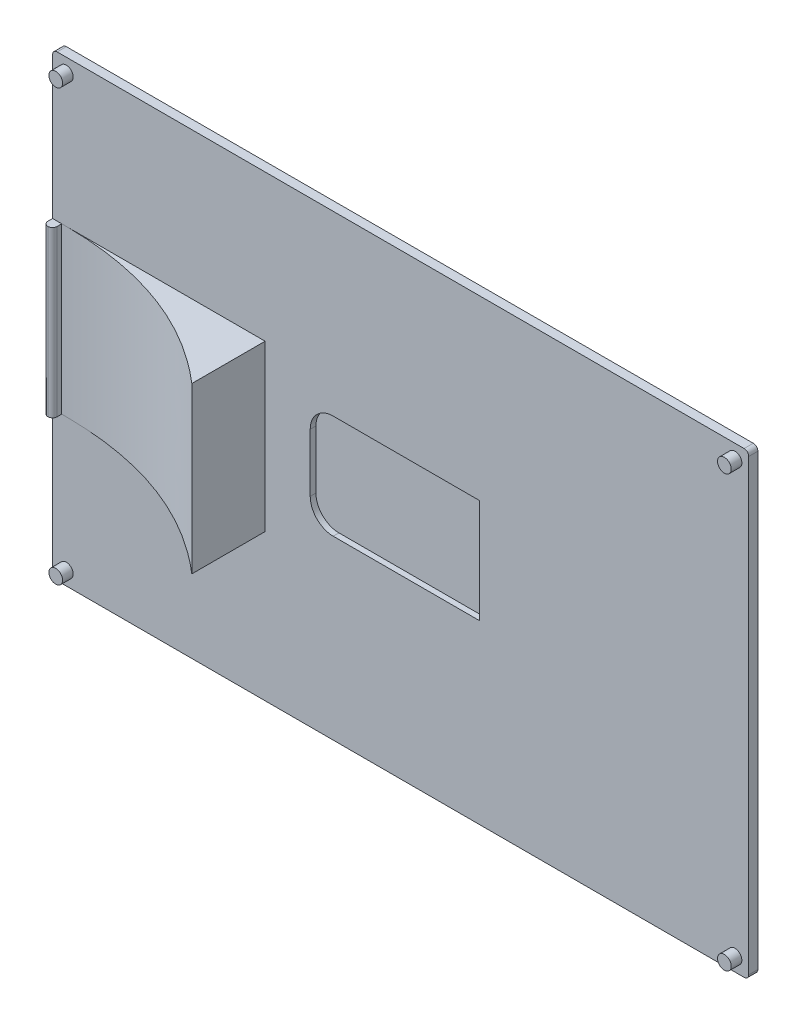
ISO-10303-21;
HEADER;
FILE_DESCRIPTION(('STEP AP214'),'2;1');
FILE_NAME('part.step','',(''),(''),'','','');
FILE_SCHEMA(('AUTOMOTIVE_DESIGN { 1 0 10303 214 1 1 1 1 }'));
ENDSEC;
DATA;
#1=APPLICATION_CONTEXT('core data for automotive mechanical design processes');
#2=APPLICATION_PROTOCOL_DEFINITION('international standard','automotive_design',2000,#1);
#3=PRODUCT_CONTEXT('',#1,'mechanical');
#4=PRODUCT('Part','Part','',(#3));
#5=PRODUCT_RELATED_PRODUCT_CATEGORY('part','',(#4));
#6=PRODUCT_DEFINITION_FORMATION('','',#4);
#7=PRODUCT_DEFINITION_CONTEXT('part definition',#1,'design');
#8=PRODUCT_DEFINITION('design','',#6,#7);
#9=PRODUCT_DEFINITION_SHAPE('','',#8);
#10=(LENGTH_UNIT() NAMED_UNIT(*) SI_UNIT(.MILLI.,.METRE.));
#11=(NAMED_UNIT(*) PLANE_ANGLE_UNIT() SI_UNIT($,.RADIAN.));
#12=(NAMED_UNIT(*) SI_UNIT($,.STERADIAN.) SOLID_ANGLE_UNIT());
#13=UNCERTAINTY_MEASURE_WITH_UNIT(LENGTH_MEASURE(1.E-05),#10,'distance_accuracy_value','');
#14=(GEOMETRIC_REPRESENTATION_CONTEXT(3) GLOBAL_UNCERTAINTY_ASSIGNED_CONTEXT((#13)) GLOBAL_UNIT_ASSIGNED_CONTEXT((#10,
#11,#12)) REPRESENTATION_CONTEXT('',''));
#15=CARTESIAN_POINT('',(0.,0.,0.));
#16=DIRECTION('',(0.,0.,1.));
#17=DIRECTION('',(1.,0.,0.));
#18=AXIS2_PLACEMENT_3D('',#15,#16,#17);
#19=CARTESIAN_POINT('',(0.,18.,18.));
#20=DIRECTION('',(0.,-1.,0.));
#21=DIRECTION('',(1.,0.,0.));
#22=AXIS2_PLACEMENT_3D('',#19,#20,#21);
#23=PLANE('',#22);
#24=DIRECTION('',(-1.,0.,0.));
#25=VECTOR('',#24,1.);
#26=CARTESIAN_POINT('',(0.,18.,2.));
#27=LINE('',#26,#25);
#28=CARTESIAN_POINT('',(-28.5956977565576,18.,2.));
#29=VERTEX_POINT('',#28);
#30=CARTESIAN_POINT('',(-71.6825837771645,18.,1.99999999964443));
#31=VERTEX_POINT('',#30);
#32=EDGE_CURVE('E214',#29,#31,#27,.T.);
#33=ORIENTED_EDGE('',*,*,#32,.T.);
#34=CARTESIAN_POINT('',(-73.,18.,2.));
#35=CARTESIAN_POINT('',(-47.36065202084,18.,1.78829908278211));
#36=CARTESIAN_POINT('',(-28.5956977565576,18.,18.));
#37=B_SPLINE_CURVE_WITH_KNOTS('',2,(#34,#35,#36),.UNSPECIFIED.,.F.,.F.,(3,3),(0.,1.),.UNSPECIFIED.);
#38=CARTESIAN_POINT('',(-28.5956977565576,18.,18.));
#39=VERTEX_POINT('',#38);
#40=EDGE_CURVE('E199',#31,#39,#37,.T.);
#41=ORIENTED_EDGE('',*,*,#40,.T.);
#42=DIRECTION('',(0.,0.,-1.));
#43=VECTOR('',#42,1.);
#44=CARTESIAN_POINT('',(-28.5956977565576,18.,18.));
#45=LINE('',#44,#43);
#46=EDGE_CURVE('E207',#39,#29,#45,.T.);
#47=ORIENTED_EDGE('',*,*,#46,.T.);
#48=EDGE_LOOP('',(#33,#41,#47));
#49=FACE_BOUND('',#48,.T.);
#50=ADVANCED_FACE('F47',(#49),#23,.F.);
#51=CARTESIAN_POINT('',(0.,-18.,18.));
#52=DIRECTION('',(0.,-1.,0.));
#53=DIRECTION('',(1.,0.,0.));
#54=AXIS2_PLACEMENT_3D('',#51,#52,#53);
#55=PLANE('',#54);
#56=CARTESIAN_POINT('',(-73.,-18.,2.));
#57=CARTESIAN_POINT('',(-47.36065202084,-18.,1.78829908278211));
#58=CARTESIAN_POINT('',(-28.5956977565576,-18.,18.));
#59=B_SPLINE_CURVE_WITH_KNOTS('',2,(#56,#57,#58),.UNSPECIFIED.,.F.,.F.,(3,3),(0.,1.),.UNSPECIFIED.);
#60=CARTESIAN_POINT('',(-71.6825837771645,-18.,1.99999999964443));
#61=VERTEX_POINT('',#60);
#62=CARTESIAN_POINT('',(-28.5956977565576,-18.,18.));
#63=VERTEX_POINT('',#62);
#64=EDGE_CURVE('E202',#61,#63,#59,.T.);
#65=ORIENTED_EDGE('',*,*,#64,.F.);
#66=DIRECTION('',(-1.,0.,0.));
#67=VECTOR('',#66,1.);
#68=CARTESIAN_POINT('',(0.,-18.,2.));
#69=LINE('',#68,#67);
#70=CARTESIAN_POINT('',(-28.5956977565576,-18.,2.));
#71=VERTEX_POINT('',#70);
#72=EDGE_CURVE('E376',#71,#61,#69,.T.);
#73=ORIENTED_EDGE('',*,*,#72,.F.);
#74=DIRECTION('',(0.,0.,-1.));
#75=VECTOR('',#74,1.);
#76=CARTESIAN_POINT('',(-28.5956977565576,-18.,18.));
#77=LINE('',#76,#75);
#78=EDGE_CURVE('E221',#63,#71,#77,.T.);
#79=ORIENTED_EDGE('',*,*,#78,.F.);
#80=EDGE_LOOP('',(#65,#73,#79));
#81=FACE_BOUND('',#80,.T.);
#82=ADVANCED_FACE('F501',(#81),#55,.T.);
#83=CARTESIAN_POINT('',(0.,-11.4395497970356,2.));
#84=DIRECTION('',(0.,-1.,0.));
#85=DIRECTION('',(1.,0.,0.));
#86=AXIS2_PLACEMENT_3D('',#83,#84,#85);
#87=PLANE('',#86);
#88=DIRECTION('',(0.,0.,-1.));
#89=VECTOR('',#88,1.);
#90=CARTESIAN_POINT('',(18.1670824158721,-11.4395497970356,2.));
#91=LINE('',#90,#89);
#92=CARTESIAN_POINT('',(18.1670824158721,-11.4395497970356,2.));
#93=VERTEX_POINT('',#92);
#94=CARTESIAN_POINT('',(18.1670824158721,-11.4395497970356,0.746944487882492));
#95=VERTEX_POINT('',#94);
#96=EDGE_CURVE('E367',#93,#95,#91,.T.);
#97=ORIENTED_EDGE('',*,*,#96,.T.);
#98=DIRECTION('',(-1.,0.,0.));
#99=VECTOR('',#98,1.);
#100=CARTESIAN_POINT('',(0.,-11.4395497970356,0.746944487882492));
#101=LINE('',#100,#99);
#102=CARTESIAN_POINT('',(-13.7255744160053,-11.4395497970356,0.746944487882492));
#103=VERTEX_POINT('',#102);
#104=EDGE_CURVE('E233',#95,#103,#101,.T.);
#105=ORIENTED_EDGE('',*,*,#104,.T.);
#106=DIRECTION('',(0.,0.,-1.));
#107=VECTOR('',#106,1.);
#108=CARTESIAN_POINT('',(-13.7255744160053,-11.4395497970356,2.));
#109=LINE('',#108,#107);
#110=CARTESIAN_POINT('',(-13.7255744160053,-11.4395497970356,2.));
#111=VERTEX_POINT('',#110);
#112=EDGE_CURVE('E339',#111,#103,#109,.T.);
#113=ORIENTED_EDGE('',*,*,#112,.F.);
#114=DIRECTION('',(-1.,0.,0.));
#115=VECTOR('',#114,1.);
#116=CARTESIAN_POINT('',(0.,-11.4395497970356,2.));
#117=LINE('',#116,#115);
#118=EDGE_CURVE('E424',#93,#111,#117,.T.);
#119=ORIENTED_EDGE('',*,*,#118,.F.);
#120=EDGE_LOOP('',(#97,#105,#113,#119));
#121=FACE_BOUND('',#120,.T.);
#122=ADVANCED_FACE('F482',(#121),#87,.F.);
#123=CARTESIAN_POINT('',(-13.7255744160053,-6.41721206719666,2.));
#124=DIRECTION('',(0.,0.,-1.));
#125=DIRECTION('',(-1.,0.,0.));
#126=AXIS2_PLACEMENT_3D('',#123,#124,#125);
#127=CYLINDRICAL_SURFACE('',#126,5.0223377298389);
#128=ORIENTED_EDGE('',*,*,#112,.T.);
#129=CARTESIAN_POINT('',(-13.7255744160053,-6.41721206719666,0.746944487882492));
#130=DIRECTION('',(0.,0.,1.));
#131=DIRECTION('',(1.,0.,0.));
#132=AXIS2_PLACEMENT_3D('',#129,#130,#131);
#133=CIRCLE('',#132,5.0223377298389);
#134=CARTESIAN_POINT('',(-18.7479121458442,-6.41721206719661,0.746944487882492));
#135=VERTEX_POINT('',#134);
#136=EDGE_CURVE('E230',#103,#135,#133,.F.);
#137=ORIENTED_EDGE('',*,*,#136,.T.);
#138=DIRECTION('',(0.,0.,-1.));
#139=VECTOR('',#138,1.);
#140=CARTESIAN_POINT('',(-18.7479121458442,-6.41721206719661,2.));
#141=LINE('',#140,#139);
#142=CARTESIAN_POINT('',(-18.7479121458442,-6.41721206719661,2.));
#143=VERTEX_POINT('',#142);
#144=EDGE_CURVE('E341',#143,#135,#141,.T.);
#145=ORIENTED_EDGE('',*,*,#144,.F.);
#146=CARTESIAN_POINT('',(-13.7255744160053,-6.41721206719666,2.));
#147=DIRECTION('',(0.,0.,1.));
#148=DIRECTION('',(1.,0.,0.));
#149=AXIS2_PLACEMENT_3D('',#146,#147,#148);
#150=CIRCLE('',#149,5.0223377298389);
#151=EDGE_CURVE('E427',#111,#143,#150,.F.);
#152=ORIENTED_EDGE('',*,*,#151,.F.);
#153=EDGE_LOOP('',(#128,#137,#145,#152));
#154=FACE_BOUND('',#153,.T.);
#155=ADVANCED_FACE('F476',(#154),#127,.F.);
#156=CARTESIAN_POINT('',(-18.7479121458442,0.,2.));
#157=DIRECTION('',(-1.,0.,0.));
#158=DIRECTION('',(0.,0.,1.));
#159=AXIS2_PLACEMENT_3D('',#156,#157,#158);
#160=PLANE('',#159);
#161=ORIENTED_EDGE('',*,*,#144,.T.);
#162=DIRECTION('',(0.,1.,0.));
#163=VECTOR('',#162,1.);
#164=CARTESIAN_POINT('',(-18.7479121458442,0.,0.746944487882492));
#165=LINE('',#164,#163);
#166=CARTESIAN_POINT('',(-18.7479121458442,6.27503462279325,0.746944487882492));
#167=VERTEX_POINT('',#166);
#168=EDGE_CURVE('E244',#135,#167,#165,.T.);
#169=ORIENTED_EDGE('',*,*,#168,.T.);
#170=DIRECTION('',(0.,0.,-1.));
#171=VECTOR('',#170,1.);
#172=CARTESIAN_POINT('',(-18.7479121458442,6.27503462279325,2.));
#173=LINE('',#172,#171);
#174=CARTESIAN_POINT('',(-18.7479121458442,6.27503462279325,2.));
#175=VERTEX_POINT('',#174);
#176=EDGE_CURVE('E346',#175,#167,#173,.T.);
#177=ORIENTED_EDGE('',*,*,#176,.F.);
#178=DIRECTION('',(0.,1.,0.));
#179=VECTOR('',#178,1.);
#180=CARTESIAN_POINT('',(-18.7479121458442,0.,2.));
#181=LINE('',#180,#179);
#182=EDGE_CURVE('E429',#143,#175,#181,.T.);
#183=ORIENTED_EDGE('',*,*,#182,.F.);
#184=EDGE_LOOP('',(#161,#169,#177,#183));
#185=FACE_BOUND('',#184,.T.);
#186=ADVANCED_FACE('F473',(#185),#160,.F.);
#187=CARTESIAN_POINT('',(-13.7479121458442,6.27503462279331,2.));
#188=DIRECTION('',(0.,0.,-1.));
#189=DIRECTION('',(-1.,0.,0.));
#190=AXIS2_PLACEMENT_3D('',#187,#188,#189);
#191=CYLINDRICAL_SURFACE('',#190,5.);
#192=CARTESIAN_POINT('',(-13.7479121458442,6.27503462279331,0.746944487882492));
#193=DIRECTION('',(0.,0.,1.));
#194=DIRECTION('',(1.,0.,0.));
#195=AXIS2_PLACEMENT_3D('',#192,#193,#194);
#196=CIRCLE('',#195,5.);
#197=CARTESIAN_POINT('',(-13.7479121458442,11.2750346227933,0.746944487882492));
#198=VERTEX_POINT('',#197);
#199=EDGE_CURVE('E242',#198,#167,#196,.T.);
#200=ORIENTED_EDGE('',*,*,#199,.F.);
#201=DIRECTION('',(0.,0.,-1.));
#202=VECTOR('',#201,1.);
#203=CARTESIAN_POINT('',(-13.7479121458442,11.2750346227933,2.));
#204=LINE('',#203,#202);
#205=CARTESIAN_POINT('',(-13.7479121458442,11.2750346227933,2.));
#206=VERTEX_POINT('',#205);
#207=EDGE_CURVE('E463',#206,#198,#204,.T.);
#208=ORIENTED_EDGE('',*,*,#207,.F.);
#209=CARTESIAN_POINT('',(-13.7479121458442,6.27503462279331,2.));
#210=DIRECTION('',(0.,0.,1.));
#211=DIRECTION('',(1.,0.,0.));
#212=AXIS2_PLACEMENT_3D('',#209,#210,#211);
#213=CIRCLE('',#212,5.);
#214=EDGE_CURVE('E431',#206,#175,#213,.T.);
#215=ORIENTED_EDGE('',*,*,#214,.T.);
#216=ORIENTED_EDGE('',*,*,#176,.T.);
#217=EDGE_LOOP('',(#200,#208,#215,#216));
#218=FACE_BOUND('',#217,.T.);
#219=ADVANCED_FACE('F469',(#218),#191,.F.);
#220=CARTESIAN_POINT('',(0.,11.2750346227933,2.));
#221=DIRECTION('',(0.,1.,0.));
#222=DIRECTION('',(-1.,0.,0.));
#223=AXIS2_PLACEMENT_3D('',#220,#221,#222);
#224=PLANE('',#223);
#225=ORIENTED_EDGE('',*,*,#207,.T.);
#226=DIRECTION('',(1.,0.,0.));
#227=VECTOR('',#226,1.);
#228=CARTESIAN_POINT('',(0.,11.2750346227933,0.746944487882492));
#229=LINE('',#228,#227);
#230=CARTESIAN_POINT('',(18.1670824158721,11.2750346227933,0.746944487882492));
#231=VERTEX_POINT('',#230);
#232=EDGE_CURVE('E239',#198,#231,#229,.T.);
#233=ORIENTED_EDGE('',*,*,#232,.T.);
#234=DIRECTION('',(0.,0.,-1.));
#235=VECTOR('',#234,1.);
#236=CARTESIAN_POINT('',(18.1670824158721,11.2750346227933,2.));
#237=LINE('',#236,#235);
#238=CARTESIAN_POINT('',(18.1670824158721,11.2750346227933,2.));
#239=VERTEX_POINT('',#238);
#240=EDGE_CURVE('E460',#239,#231,#237,.T.);
#241=ORIENTED_EDGE('',*,*,#240,.F.);
#242=DIRECTION('',(1.,0.,0.));
#243=VECTOR('',#242,1.);
#244=CARTESIAN_POINT('',(0.,11.2750346227933,2.));
#245=LINE('',#244,#243);
#246=EDGE_CURVE('E434',#206,#239,#245,.T.);
#247=ORIENTED_EDGE('',*,*,#246,.F.);
#248=EDGE_LOOP('',(#225,#233,#241,#247));
#249=FACE_BOUND('',#248,.T.);
#250=ADVANCED_FACE('F487',(#249),#224,.F.);
#251=CARTESIAN_POINT('',(76.,49.,2.));
#252=DIRECTION('',(0.,0.,-1.));
#253=DIRECTION('',(-1.,0.,0.));
#254=AXIS2_PLACEMENT_3D('',#251,#252,#253);
#255=CYLINDRICAL_SURFACE('',#254,0.999999999999987);
#256=CARTESIAN_POINT('',(76.,49.,0.));
#257=DIRECTION('',(0.,0.,1.));
#258=DIRECTION('',(1.,0.,0.));
#259=AXIS2_PLACEMENT_3D('',#256,#257,#258);
#260=CIRCLE('',#259,0.999999999999987);
#261=CARTESIAN_POINT('',(76.,50.,0.));
#262=VERTEX_POINT('',#261);
#263=CARTESIAN_POINT('',(77.,49.,0.));
#264=VERTEX_POINT('',#263);
#265=EDGE_CURVE('E247',#262,#264,#260,.F.);
#266=ORIENTED_EDGE('',*,*,#265,.F.);
#267=DIRECTION('',(0.,0.,-1.));
#268=VECTOR('',#267,1.);
#269=CARTESIAN_POINT('',(76.,50.,2.));
#270=LINE('',#269,#268);
#271=CARTESIAN_POINT('',(76.,50.,2.));
#272=VERTEX_POINT('',#271);
#273=EDGE_CURVE('E365',#272,#262,#270,.T.);
#274=ORIENTED_EDGE('',*,*,#273,.F.);
#275=CARTESIAN_POINT('',(76.,49.,2.));
#276=DIRECTION('',(0.,0.,1.));
#277=DIRECTION('',(1.,0.,0.));
#278=AXIS2_PLACEMENT_3D('',#275,#276,#277);
#279=CIRCLE('',#278,0.999999999999987);
#280=CARTESIAN_POINT('',(77.,49.,2.));
#281=VERTEX_POINT('',#280);
#282=EDGE_CURVE('E255',#272,#281,#279,.F.);
#283=ORIENTED_EDGE('',*,*,#282,.T.);
#284=DIRECTION('',(0.,0.,-1.));
#285=VECTOR('',#284,1.);
#286=CARTESIAN_POINT('',(77.,49.,2.));
#287=LINE('',#286,#285);
#288=EDGE_CURVE('E350',#281,#264,#287,.T.);
#289=ORIENTED_EDGE('',*,*,#288,.T.);
#290=EDGE_LOOP('',(#266,#274,#283,#289));
#291=FACE_BOUND('',#290,.T.);
#292=ADVANCED_FACE('F489',(#291),#255,.T.);
#293=CARTESIAN_POINT('',(0.,50.,2.));
#294=DIRECTION('',(0.,1.,0.));
#295=DIRECTION('',(0.,0.,1.));
#296=AXIS2_PLACEMENT_3D('',#293,#294,#295);
#297=PLANE('',#296);
#298=DIRECTION('',(1.,0.,0.));
#299=VECTOR('',#298,1.);
#300=CARTESIAN_POINT('',(0.,50.,0.));
#301=LINE('',#300,#299);
#302=CARTESIAN_POINT('',(-74.,50.,0.));
#303=VERTEX_POINT('',#302);
#304=EDGE_CURVE('E439',#303,#262,#301,.T.);
#305=ORIENTED_EDGE('',*,*,#304,.F.);
#306=DIRECTION('',(0.,0.,-1.));
#307=VECTOR('',#306,1.);
#308=CARTESIAN_POINT('',(-74.,50.,2.));
#309=LINE('',#308,#307);
#310=CARTESIAN_POINT('',(-74.,50.,2.));
#311=VERTEX_POINT('',#310);
#312=EDGE_CURVE('E363',#311,#303,#309,.T.);
#313=ORIENTED_EDGE('',*,*,#312,.F.);
#314=DIRECTION('',(1.,0.,0.));
#315=VECTOR('',#314,1.);
#316=CARTESIAN_POINT('',(0.,50.,2.));
#317=LINE('',#316,#315);
#318=EDGE_CURVE('E258',#311,#272,#317,.T.);
#319=ORIENTED_EDGE('',*,*,#318,.T.);
#320=ORIENTED_EDGE('',*,*,#273,.T.);
#321=EDGE_LOOP('',(#305,#313,#319,#320));
#322=FACE_BOUND('',#321,.T.);
#323=ADVANCED_FACE('F496',(#322),#297,.T.);
#324=CARTESIAN_POINT('',(-74.,49.,2.));
#325=DIRECTION('',(0.,0.,-1.));
#326=DIRECTION('',(-1.,0.,0.));
#327=AXIS2_PLACEMENT_3D('',#324,#325,#326);
#328=CYLINDRICAL_SURFACE('',#327,1.);
#329=CARTESIAN_POINT('',(-74.,49.,0.));
#330=DIRECTION('',(0.,0.,1.));
#331=DIRECTION('',(1.,0.,0.));
#332=AXIS2_PLACEMENT_3D('',#329,#330,#331);
#333=CIRCLE('',#332,1.);
#334=CARTESIAN_POINT('',(-75.,49.,0.));
#335=VERTEX_POINT('',#334);
#336=EDGE_CURVE('E442',#335,#303,#333,.F.);
#337=ORIENTED_EDGE('',*,*,#336,.F.);
#338=DIRECTION('',(0.,0.,-1.));
#339=VECTOR('',#338,1.);
#340=CARTESIAN_POINT('',(-75.,49.,2.));
#341=LINE('',#340,#339);
#342=CARTESIAN_POINT('',(-75.,49.,2.));
#343=VERTEX_POINT('',#342);
#344=EDGE_CURVE('E327',#343,#335,#341,.T.);
#345=ORIENTED_EDGE('',*,*,#344,.F.);
#346=CARTESIAN_POINT('',(-74.,49.,2.));
#347=DIRECTION('',(0.,0.,1.));
#348=DIRECTION('',(1.,0.,0.));
#349=AXIS2_PLACEMENT_3D('',#346,#347,#348);
#350=CIRCLE('',#349,1.);
#351=EDGE_CURVE('E261',#343,#311,#350,.F.);
#352=ORIENTED_EDGE('',*,*,#351,.T.);
#353=ORIENTED_EDGE('',*,*,#312,.T.);
#354=EDGE_LOOP('',(#337,#345,#352,#353));
#355=FACE_BOUND('',#354,.T.);
#356=ADVANCED_FACE('F705',(#355),#328,.T.);
#357=CARTESIAN_POINT('',(-75.,0.,2.));
#358=DIRECTION('',(1.,0.,0.));
#359=DIRECTION('',(0.,0.,-1.));
#360=AXIS2_PLACEMENT_3D('',#357,#358,#359);
#361=PLANE('',#360);
#362=DIRECTION('',(0.,0.,-1.));
#363=VECTOR('',#362,1.);
#364=CARTESIAN_POINT('',(-75.,-18.,18.));
#365=LINE('',#364,#363);
#366=CARTESIAN_POINT('',(-75.,-18.,3.));
#367=VERTEX_POINT('',#366);
#368=CARTESIAN_POINT('',(-75.,-18.,2.));
#369=VERTEX_POINT('',#368);
#370=EDGE_CURVE('E223',#367,#369,#365,.T.);
#371=ORIENTED_EDGE('',*,*,#370,.F.);
#372=DIRECTION('',(0.,-1.,0.));
#373=VECTOR('',#372,1.);
#374=CARTESIAN_POINT('',(-75.,0.,3.));
#375=LINE('',#374,#373);
#376=CARTESIAN_POINT('',(-75.,18.,3.));
#377=VERTEX_POINT('',#376);
#378=EDGE_CURVE('E11',#367,#377,#375,.F.);
#379=ORIENTED_EDGE('',*,*,#378,.T.);
#380=DIRECTION('',(0.,0.,-1.));
#381=VECTOR('',#380,1.);
#382=CARTESIAN_POINT('',(-75.,18.,18.));
#383=LINE('',#382,#381);
#384=CARTESIAN_POINT('',(-75.,18.,2.));
#385=VERTEX_POINT('',#384);
#386=EDGE_CURVE('E228',#377,#385,#383,.T.);
#387=ORIENTED_EDGE('',*,*,#386,.T.);
#388=DIRECTION('',(0.,-1.,0.));
#389=VECTOR('',#388,1.);
#390=CARTESIAN_POINT('',(-75.,0.,2.));
#391=LINE('',#390,#389);
#392=EDGE_CURVE('E264',#343,#385,#391,.T.);
#393=ORIENTED_EDGE('',*,*,#392,.F.);
#394=ORIENTED_EDGE('',*,*,#344,.T.);
#395=DIRECTION('',(0.,-1.,0.));
#396=VECTOR('',#395,1.);
#397=CARTESIAN_POINT('',(-75.,0.,0.));
#398=LINE('',#397,#396);
#399=CARTESIAN_POINT('',(-75.,-49.,0.));
#400=VERTEX_POINT('',#399);
#401=EDGE_CURVE('E445',#335,#400,#398,.T.);
#402=ORIENTED_EDGE('',*,*,#401,.T.);
#403=DIRECTION('',(0.,0.,-1.));
#404=VECTOR('',#403,1.);
#405=CARTESIAN_POINT('',(-75.,-49.,2.));
#406=LINE('',#405,#404);
#407=CARTESIAN_POINT('',(-75.,-49.,2.));
#408=VERTEX_POINT('',#407);
#409=EDGE_CURVE('E360',#408,#400,#406,.T.);
#410=ORIENTED_EDGE('',*,*,#409,.F.);
#411=DIRECTION('',(0.,-1.,0.));
#412=VECTOR('',#411,1.);
#413=CARTESIAN_POINT('',(-75.,0.,2.));
#414=LINE('',#413,#412);
#415=EDGE_CURVE('E404',#369,#408,#414,.T.);
#416=ORIENTED_EDGE('',*,*,#415,.F.);
#417=EDGE_LOOP('',(#371,#379,#387,#393,#394,#402,#410,#416));
#418=FACE_BOUND('',#417,.T.);
#419=ADVANCED_FACE('F325',(#418),#361,.F.);
#420=CARTESIAN_POINT('',(-74.,-49.,2.));
#421=DIRECTION('',(0.,0.,-1.));
#422=DIRECTION('',(-1.,0.,0.));
#423=AXIS2_PLACEMENT_3D('',#420,#421,#422);
#424=CYLINDRICAL_SURFACE('',#423,1.);
#425=CARTESIAN_POINT('',(-74.,-49.,0.));
#426=DIRECTION('',(0.,0.,1.));
#427=DIRECTION('',(1.,0.,0.));
#428=AXIS2_PLACEMENT_3D('',#425,#426,#427);
#429=CIRCLE('',#428,1.);
#430=CARTESIAN_POINT('',(-74.,-50.,0.));
#431=VERTEX_POINT('',#430);
#432=EDGE_CURVE('E447',#431,#400,#429,.F.);
#433=ORIENTED_EDGE('',*,*,#432,.F.);
#434=DIRECTION('',(0.,0.,-1.));
#435=VECTOR('',#434,1.);
#436=CARTESIAN_POINT('',(-74.,-50.,2.));
#437=LINE('',#436,#435);
#438=CARTESIAN_POINT('',(-74.,-50.,2.));
#439=VERTEX_POINT('',#438);
#440=EDGE_CURVE('E358',#439,#431,#437,.T.);
#441=ORIENTED_EDGE('',*,*,#440,.F.);
#442=CARTESIAN_POINT('',(-74.,-49.,2.));
#443=DIRECTION('',(0.,0.,1.));
#444=DIRECTION('',(1.,0.,0.));
#445=AXIS2_PLACEMENT_3D('',#442,#443,#444);
#446=CIRCLE('',#445,1.);
#447=EDGE_CURVE('E407',#439,#408,#446,.F.);
#448=ORIENTED_EDGE('',*,*,#447,.T.);
#449=ORIENTED_EDGE('',*,*,#409,.T.);
#450=EDGE_LOOP('',(#433,#441,#448,#449));
#451=FACE_BOUND('',#450,.T.);
#452=ADVANCED_FACE('F529',(#451),#424,.T.);
#453=CARTESIAN_POINT('',(0.,-50.,2.));
#454=DIRECTION('',(0.,1.,0.));
#455=DIRECTION('',(0.,0.,1.));
#456=AXIS2_PLACEMENT_3D('',#453,#454,#455);
#457=PLANE('',#456);
#458=DIRECTION('',(1.,0.,0.));
#459=VECTOR('',#458,1.);
#460=CARTESIAN_POINT('',(0.,-50.,0.));
#461=LINE('',#460,#459);
#462=CARTESIAN_POINT('',(76.,-50.,0.));
#463=VERTEX_POINT('',#462);
#464=EDGE_CURVE('E450',#431,#463,#461,.T.);
#465=ORIENTED_EDGE('',*,*,#464,.T.);
#466=DIRECTION('',(0.,0.,-1.));
#467=VECTOR('',#466,1.);
#468=CARTESIAN_POINT('',(76.,-50.,2.));
#469=LINE('',#468,#467);
#470=CARTESIAN_POINT('',(76.,-50.,2.));
#471=VERTEX_POINT('',#470);
#472=EDGE_CURVE('E355',#471,#463,#469,.T.);
#473=ORIENTED_EDGE('',*,*,#472,.F.);
#474=DIRECTION('',(1.,0.,0.));
#475=VECTOR('',#474,1.);
#476=CARTESIAN_POINT('',(0.,-50.,2.));
#477=LINE('',#476,#475);
#478=EDGE_CURVE('E410',#439,#471,#477,.T.);
#479=ORIENTED_EDGE('',*,*,#478,.F.);
#480=ORIENTED_EDGE('',*,*,#440,.T.);
#481=EDGE_LOOP('',(#465,#473,#479,#480));
#482=FACE_BOUND('',#481,.T.);
#483=ADVANCED_FACE('F713',(#482),#457,.F.);
#484=CARTESIAN_POINT('',(76.,-49.,2.));
#485=DIRECTION('',(0.,0.,-1.));
#486=DIRECTION('',(-1.,0.,0.));
#487=AXIS2_PLACEMENT_3D('',#484,#485,#486);
#488=CYLINDRICAL_SURFACE('',#487,1.);
#489=CARTESIAN_POINT('',(76.,-49.,0.));
#490=DIRECTION('',(0.,0.,1.));
#491=DIRECTION('',(1.,0.,0.));
#492=AXIS2_PLACEMENT_3D('',#489,#490,#491);
#493=CIRCLE('',#492,1.);
#494=CARTESIAN_POINT('',(77.,-49.,0.));
#495=VERTEX_POINT('',#494);
#496=EDGE_CURVE('E453',#463,#495,#493,.T.);
#497=ORIENTED_EDGE('',*,*,#496,.T.);
#498=DIRECTION('',(0.,0.,-1.));
#499=VECTOR('',#498,1.);
#500=CARTESIAN_POINT('',(77.,-49.,2.));
#501=LINE('',#500,#499);
#502=CARTESIAN_POINT('',(77.,-49.,2.));
#503=VERTEX_POINT('',#502);
#504=EDGE_CURVE('E352',#503,#495,#501,.T.);
#505=ORIENTED_EDGE('',*,*,#504,.F.);
#506=CARTESIAN_POINT('',(76.,-49.,2.));
#507=DIRECTION('',(0.,0.,1.));
#508=DIRECTION('',(1.,0.,0.));
#509=AXIS2_PLACEMENT_3D('',#506,#507,#508);
#510=CIRCLE('',#509,1.);
#511=EDGE_CURVE('E413',#471,#503,#510,.T.);
#512=ORIENTED_EDGE('',*,*,#511,.F.);
#513=ORIENTED_EDGE('',*,*,#472,.T.);
#514=EDGE_LOOP('',(#497,#505,#512,#513));
#515=FACE_BOUND('',#514,.T.);
#516=ADVANCED_FACE('F716',(#515),#488,.T.);
#517=CARTESIAN_POINT('',(77.,0.,2.));
#518=DIRECTION('',(1.,0.,0.));
#519=DIRECTION('',(0.,1.,0.));
#520=AXIS2_PLACEMENT_3D('',#517,#518,#519);
#521=PLANE('',#520);
#522=DIRECTION('',(0.,-1.,0.));
#523=VECTOR('',#522,1.);
#524=CARTESIAN_POINT('',(77.,0.,0.));
#525=LINE('',#524,#523);
#526=EDGE_CURVE('E252',#264,#495,#525,.T.);
#527=ORIENTED_EDGE('',*,*,#526,.F.);
#528=ORIENTED_EDGE('',*,*,#288,.F.);
#529=DIRECTION('',(0.,-1.,0.));
#530=VECTOR('',#529,1.);
#531=CARTESIAN_POINT('',(77.,0.,2.));
#532=LINE('',#531,#530);
#533=EDGE_CURVE('E415',#281,#503,#532,.T.);
#534=ORIENTED_EDGE('',*,*,#533,.T.);
#535=ORIENTED_EDGE('',*,*,#504,.T.);
#536=EDGE_LOOP('',(#527,#528,#534,#535));
#537=FACE_BOUND('',#536,.T.);
#538=ADVANCED_FACE('F720',(#537),#521,.T.);
#539=CARTESIAN_POINT('',(18.1670824158721,0.,2.));
#540=DIRECTION('',(1.,0.,0.));
#541=DIRECTION('',(0.,1.,0.));
#542=AXIS2_PLACEMENT_3D('',#539,#540,#541);
#543=PLANE('',#542);
#544=ORIENTED_EDGE('',*,*,#240,.T.);
#545=DIRECTION('',(0.,-1.,0.));
#546=VECTOR('',#545,1.);
#547=CARTESIAN_POINT('',(18.1670824158721,0.,0.746944487882492));
#548=LINE('',#547,#546);
#549=EDGE_CURVE('E236',#231,#95,#548,.T.);
#550=ORIENTED_EDGE('',*,*,#549,.T.);
#551=ORIENTED_EDGE('',*,*,#96,.F.);
#552=DIRECTION('',(0.,-1.,0.));
#553=VECTOR('',#552,1.);
#554=CARTESIAN_POINT('',(18.1670824158721,0.,2.));
#555=LINE('',#554,#553);
#556=EDGE_CURVE('E353',#239,#93,#555,.T.);
#557=ORIENTED_EDGE('',*,*,#556,.F.);
#558=EDGE_LOOP('',(#544,#550,#551,#557));
#559=FACE_BOUND('',#558,.T.);
#560=ADVANCED_FACE('F388',(#559),#543,.F.);
#561=CARTESIAN_POINT('',(0.,0.,2.));
#562=DIRECTION('',(0.,0.,1.));
#563=DIRECTION('',(1.,0.,0.));
#564=AXIS2_PLACEMENT_3D('',#561,#562,#563);
#565=PLANE('',#564);
#566=CARTESIAN_POINT('',(-72.,-47.,2.));
#567=DIRECTION('',(0.,0.,1.));
#568=DIRECTION('',(1.,0.,0.));
#569=AXIS2_PLACEMENT_3D('',#566,#567,#568);
#570=CIRCLE('',#569,1.5);
#571=CARTESIAN_POINT('',(-70.5,-47.,2.));
#572=VERTEX_POINT('',#571);
#573=EDGE_CURVE('E248',#572,#572,#570,.T.);
#574=ORIENTED_EDGE('',*,*,#573,.F.);
#575=EDGE_LOOP('',(#574));
#576=FACE_BOUND('',#575,.T.);
#577=CARTESIAN_POINT('',(74.,-47.,2.));
#578=DIRECTION('',(0.,0.,1.));
#579=DIRECTION('',(1.,0.,0.));
#580=AXIS2_PLACEMENT_3D('',#577,#578,#579);
#581=CIRCLE('',#580,1.5);
#582=CARTESIAN_POINT('',(75.5,-47.,2.));
#583=VERTEX_POINT('',#582);
#584=EDGE_CURVE('E251',#583,#583,#581,.T.);
#585=ORIENTED_EDGE('',*,*,#584,.F.);
#586=EDGE_LOOP('',(#585));
#587=FACE_BOUND('',#586,.T.);
#588=ORIENTED_EDGE('',*,*,#282,.F.);
#589=ORIENTED_EDGE('',*,*,#318,.F.);
#590=ORIENTED_EDGE('',*,*,#351,.F.);
#591=ORIENTED_EDGE('',*,*,#392,.T.);
#592=CARTESIAN_POINT('',(-73.,18.,2.));
#593=VERTEX_POINT('',#592);
#594=EDGE_CURVE('E267',#593,#385,#27,.T.);
#595=ORIENTED_EDGE('',*,*,#594,.F.);
#596=CARTESIAN_POINT('',(-71.6825837771645,18.,1.99999999964443));
#597=CARTESIAN_POINT('',(-72.3390074283071,18.,1.9945422662926));
#598=CARTESIAN_POINT('',(-73.,18.,2.));
#599=B_SPLINE_CURVE_WITH_KNOTS('',2,(#596,#597,#598),.UNSPECIFIED.,.F.,.F.,(3,3),(0.,
0.025780397076796),.UNSPECIFIED.);
#600=EDGE_CURVE('E208',#593,#31,#599,.F.);
#601=ORIENTED_EDGE('',*,*,#600,.T.);
#602=ORIENTED_EDGE('',*,*,#32,.F.);
#603=DIRECTION('',(0.,1.,0.));
#604=VECTOR('',#603,1.);
#605=CARTESIAN_POINT('',(-28.5956977565576,0.,2.));
#606=LINE('',#605,#604);
#607=EDGE_CURVE('E220',#71,#29,#606,.T.);
#608=ORIENTED_EDGE('',*,*,#607,.F.);
#609=ORIENTED_EDGE('',*,*,#72,.T.);
#610=CARTESIAN_POINT('',(-73.,-18.,2.));
#611=CARTESIAN_POINT('',(-72.3390074283071,-18.,1.9945422662926));
#612=CARTESIAN_POINT('',(-71.6825837771645,-18.,1.99999999964443));
#613=B_SPLINE_CURVE_WITH_KNOTS('',2,(#610,#611,#612),.UNSPECIFIED.,.F.,.F.,(3,3),(0.,
0.0257803970767956),.UNSPECIFIED.);
#614=CARTESIAN_POINT('',(-73.,-18.,2.));
#615=VERTEX_POINT('',#614);
#616=EDGE_CURVE('E303',#615,#61,#613,.T.);
#617=ORIENTED_EDGE('',*,*,#616,.F.);
#618=EDGE_CURVE('E401',#615,#369,#69,.T.);
#619=ORIENTED_EDGE('',*,*,#618,.T.);
#620=ORIENTED_EDGE('',*,*,#415,.T.);
#621=ORIENTED_EDGE('',*,*,#447,.F.);
#622=ORIENTED_EDGE('',*,*,#478,.T.);
#623=ORIENTED_EDGE('',*,*,#511,.T.);
#624=ORIENTED_EDGE('',*,*,#533,.F.);
#625=EDGE_LOOP('',(#588,#589,#590,#591,#595,#601,#602,#608,#609,#617,#619,#620,#621,#622,#623,#624));
#626=FACE_BOUND('',#625,.T.);
#627=CARTESIAN_POINT('',(74.,47.,2.));
#628=DIRECTION('',(0.,0.,1.));
#629=DIRECTION('',(1.,0.,0.));
#630=AXIS2_PLACEMENT_3D('',#627,#628,#629);
#631=CIRCLE('',#630,1.5);
#632=CARTESIAN_POINT('',(75.5,47.,2.));
#633=VERTEX_POINT('',#632);
#634=EDGE_CURVE('E418',#633,#633,#631,.T.);
#635=ORIENTED_EDGE('',*,*,#634,.F.);
#636=EDGE_LOOP('',(#635));
#637=FACE_BOUND('',#636,.T.);
#638=CARTESIAN_POINT('',(-72.,47.,2.));
#639=DIRECTION('',(0.,0.,1.));
#640=DIRECTION('',(1.,0.,0.));
#641=AXIS2_PLACEMENT_3D('',#638,#639,#640);
#642=CIRCLE('',#641,1.5);
#643=CARTESIAN_POINT('',(-70.5,47.,2.));
#644=VERTEX_POINT('',#643);
#645=EDGE_CURVE('E421',#644,#644,#642,.T.);
#646=ORIENTED_EDGE('',*,*,#645,.F.);
#647=EDGE_LOOP('',(#646));
#648=FACE_BOUND('',#647,.T.);
#649=ORIENTED_EDGE('',*,*,#118,.T.);
#650=ORIENTED_EDGE('',*,*,#151,.T.);
#651=ORIENTED_EDGE('',*,*,#182,.T.);
#652=ORIENTED_EDGE('',*,*,#214,.F.);
#653=ORIENTED_EDGE('',*,*,#246,.T.);
#654=ORIENTED_EDGE('',*,*,#556,.T.);
#655=EDGE_LOOP('',(#649,#650,#651,#652,#653,#654));
#656=FACE_BOUND('',#655,.T.);
#657=ADVANCED_FACE('F319',(#576,#587,#626,#637,#648,#656),#565,.T.);
#658=CARTESIAN_POINT('',(0.,0.,0.));
#659=DIRECTION('',(0.,0.,1.));
#660=DIRECTION('',(1.,0.,0.));
#661=AXIS2_PLACEMENT_3D('',#658,#659,#660);
#662=PLANE('',#661);
#663=ORIENTED_EDGE('',*,*,#401,.F.);
#664=ORIENTED_EDGE('',*,*,#336,.T.);
#665=ORIENTED_EDGE('',*,*,#304,.T.);
#666=ORIENTED_EDGE('',*,*,#265,.T.);
#667=ORIENTED_EDGE('',*,*,#526,.T.);
#668=ORIENTED_EDGE('',*,*,#496,.F.);
#669=ORIENTED_EDGE('',*,*,#464,.F.);
#670=ORIENTED_EDGE('',*,*,#432,.T.);
#671=EDGE_LOOP('',(#663,#664,#665,#666,#667,#668,#669,#670));
#672=FACE_BOUND('',#671,.T.);
#673=ADVANCED_FACE('F387',(#672),#662,.F.);
#674=CARTESIAN_POINT('',(0.,0.,0.746944487882492));
#675=DIRECTION('',(0.,0.,1.));
#676=DIRECTION('',(1.,0.,0.));
#677=AXIS2_PLACEMENT_3D('',#674,#675,#676);
#678=PLANE('',#677);
#679=ORIENTED_EDGE('',*,*,#136,.F.);
#680=ORIENTED_EDGE('',*,*,#104,.F.);
#681=ORIENTED_EDGE('',*,*,#549,.F.);
#682=ORIENTED_EDGE('',*,*,#232,.F.);
#683=ORIENTED_EDGE('',*,*,#199,.T.);
#684=ORIENTED_EDGE('',*,*,#168,.F.);
#685=EDGE_LOOP('',(#679,#680,#681,#682,#683,#684));
#686=FACE_BOUND('',#685,.T.);
#687=ADVANCED_FACE('F390',(#686),#678,.T.);
#688=CARTESIAN_POINT('',(-74.,18.,3.));
#689=DIRECTION('',(0.,-1.,0.));
#690=DIRECTION('',(1.,0.,0.));
#691=AXIS2_PLACEMENT_3D('',#688,#689,#690);
#692=CIRCLE('',#691,1.);
#693=CARTESIAN_POINT('',(-74.,18.,4.));
#694=VERTEX_POINT('',#693);
#695=EDGE_CURVE('E68',#377,#694,#692,.F.);
#696=ORIENTED_EDGE('',*,*,#695,.T.);
#697=CARTESIAN_POINT('',(-74.,18.,3.));
#698=DIRECTION('',(0.,-1.,0.));
#699=DIRECTION('',(1.,0.,0.));
#700=AXIS2_PLACEMENT_3D('',#697,#698,#699);
#701=CIRCLE('',#700,1.);
#702=CARTESIAN_POINT('',(-73.,18.,3.));
#703=VERTEX_POINT('',#702);
#704=EDGE_CURVE('E56',#694,#703,#701,.F.);
#705=ORIENTED_EDGE('',*,*,#704,.T.);
#706=DIRECTION('',(0.,0.,-1.));
#707=VECTOR('',#706,1.);
#708=CARTESIAN_POINT('',(-73.,18.,2.));
#709=LINE('',#708,#707);
#710=EDGE_CURVE('E215',#703,#593,#709,.T.);
#711=ORIENTED_EDGE('',*,*,#710,.T.);
#712=ORIENTED_EDGE('',*,*,#594,.T.);
#713=ORIENTED_EDGE('',*,*,#386,.F.);
#714=EDGE_LOOP('',(#696,#705,#711,#712,#713));
#715=FACE_BOUND('',#714,.T.);
#716=ADVANCED_FACE('F307',(#715),#23,.F.);
#717=DIRECTION('',(0.,0.,-1.));
#718=VECTOR('',#717,1.);
#719=CARTESIAN_POINT('',(-73.,-18.,2.));
#720=LINE('',#719,#718);
#721=CARTESIAN_POINT('',(-73.,-18.,3.));
#722=VERTEX_POINT('',#721);
#723=EDGE_CURVE('E216',#722,#615,#720,.T.);
#724=ORIENTED_EDGE('',*,*,#723,.F.);
#725=CARTESIAN_POINT('',(-74.,-18.,3.));
#726=DIRECTION('',(0.,-1.,0.));
#727=DIRECTION('',(1.,0.,0.));
#728=AXIS2_PLACEMENT_3D('',#725,#726,#727);
#729=CIRCLE('',#728,1.);
#730=CARTESIAN_POINT('',(-74.,-18.,4.));
#731=VERTEX_POINT('',#730);
#732=EDGE_CURVE('E332',#722,#731,#729,.T.);
#733=ORIENTED_EDGE('',*,*,#732,.T.);
#734=CARTESIAN_POINT('',(-74.,-18.,3.));
#735=DIRECTION('',(0.,-1.,0.));
#736=DIRECTION('',(1.,0.,0.));
#737=AXIS2_PLACEMENT_3D('',#734,#735,#736);
#738=CIRCLE('',#737,1.);
#739=EDGE_CURVE('E335',#731,#367,#738,.T.);
#740=ORIENTED_EDGE('',*,*,#739,.T.);
#741=ORIENTED_EDGE('',*,*,#370,.T.);
#742=ORIENTED_EDGE('',*,*,#618,.F.);
#743=EDGE_LOOP('',(#724,#733,#740,#741,#742));
#744=FACE_BOUND('',#743,.T.);
#745=ADVANCED_FACE('F508',(#744),#55,.T.);
#746=CARTESIAN_POINT('',(-28.5956977565576,0.,18.));
#747=DIRECTION('',(-1.,0.,0.));
#748=DIRECTION('',(0.,-1.,0.));
#749=AXIS2_PLACEMENT_3D('',#746,#747,#748);
#750=PLANE('',#749);
#751=ORIENTED_EDGE('',*,*,#607,.T.);
#752=ORIENTED_EDGE('',*,*,#46,.F.);
#753=DIRECTION('',(0.,1.,0.));
#754=VECTOR('',#753,1.);
#755=CARTESIAN_POINT('',(-28.5956977565576,0.,18.));
#756=LINE('',#755,#754);
#757=EDGE_CURVE('E195',#63,#39,#756,.T.);
#758=ORIENTED_EDGE('',*,*,#757,.F.);
#759=ORIENTED_EDGE('',*,*,#78,.T.);
#760=EDGE_LOOP('',(#751,#752,#758,#759));
#761=FACE_BOUND('',#760,.T.);
#762=ADVANCED_FACE('F218',(#761),#750,.F.);
#763=DIRECTION('',(0.,-1.,0.));
#764=VECTOR('',#763,1.);
#765=SURFACE_OF_LINEAR_EXTRUSION('',#37,#764);
#766=ORIENTED_EDGE('',*,*,#616,.T.);
#767=ORIENTED_EDGE('',*,*,#64,.T.);
#768=ORIENTED_EDGE('',*,*,#757,.T.);
#769=ORIENTED_EDGE('',*,*,#40,.F.);
#770=ORIENTED_EDGE('',*,*,#600,.F.);
#771=DIRECTION('',(0.,-1.,0.));
#772=VECTOR('',#771,1.);
#773=CARTESIAN_POINT('',(-73.,18.,2.));
#774=LINE('',#773,#772);
#775=EDGE_CURVE('E298',#593,#615,#774,.T.);
#776=ORIENTED_EDGE('',*,*,#775,.T.);
#777=EDGE_LOOP('',(#766,#767,#768,#769,#770,#776));
#778=FACE_BOUND('',#777,.T.);
#779=ADVANCED_FACE('F197',(#778),#765,.F.);
#780=CARTESIAN_POINT('',(-73.,18.,2.));
#781=DIRECTION('',(-1.,0.,0.));
#782=DIRECTION('',(0.,-1.,0.));
#783=AXIS2_PLACEMENT_3D('',#780,#781,#782);
#784=PLANE('',#783);
#785=ORIENTED_EDGE('',*,*,#710,.F.);
#786=DIRECTION('',(0.,-1.,0.));
#787=VECTOR('',#786,1.);
#788=CARTESIAN_POINT('',(-73.,18.,3.));
#789=LINE('',#788,#787);
#790=EDGE_CURVE('E338',#703,#722,#789,.T.);
#791=ORIENTED_EDGE('',*,*,#790,.T.);
#792=ORIENTED_EDGE('',*,*,#723,.T.);
#793=ORIENTED_EDGE('',*,*,#775,.F.);
#794=EDGE_LOOP('',(#785,#791,#792,#793));
#795=FACE_BOUND('',#794,.T.);
#796=ADVANCED_FACE('F316',(#795),#784,.F.);
#797=CARTESIAN_POINT('',(-72.,47.,4.31459470322156));
#798=DIRECTION('',(0.,0.,-1.));
#799=DIRECTION('',(-1.,0.,0.));
#800=AXIS2_PLACEMENT_3D('',#797,#798,#799);
#801=CYLINDRICAL_SURFACE('',#800,1.5);
#802=ORIENTED_EDGE('',*,*,#645,.T.);
#803=EDGE_LOOP('',(#802));
#804=FACE_BOUND('',#803,.T.);
#805=CARTESIAN_POINT('',(-72.,47.,4.31459470322156));
#806=DIRECTION('',(0.,0.,1.));
#807=DIRECTION('',(1.,0.,0.));
#808=AXIS2_PLACEMENT_3D('',#805,#806,#807);
#809=CIRCLE('',#808,1.5);
#810=CARTESIAN_POINT('',(-70.5,47.,4.31459470322156));
#811=VERTEX_POINT('',#810);
#812=EDGE_CURVE('E288',#811,#811,#809,.T.);
#813=ORIENTED_EDGE('',*,*,#812,.F.);
#814=EDGE_LOOP('',(#813));
#815=FACE_BOUND('',#814,.T.);
#816=ADVANCED_FACE('F550',(#804,#815),#801,.T.);
#817=CARTESIAN_POINT('',(0.,0.,4.31459470322156));
#818=DIRECTION('',(0.,0.,1.));
#819=DIRECTION('',(1.,0.,0.));
#820=AXIS2_PLACEMENT_3D('',#817,#818,#819);
#821=PLANE('',#820);
#822=ORIENTED_EDGE('',*,*,#812,.T.);
#823=EDGE_LOOP('',(#822));
#824=FACE_BOUND('',#823,.T.);
#825=ADVANCED_FACE('F548',(#824),#821,.T.);
#826=CARTESIAN_POINT('',(74.,47.,4.31459470322156));
#827=DIRECTION('',(0.,0.,-1.));
#828=DIRECTION('',(-1.,0.,0.));
#829=AXIS2_PLACEMENT_3D('',#826,#827,#828);
#830=CYLINDRICAL_SURFACE('',#829,1.5);
#831=ORIENTED_EDGE('',*,*,#634,.T.);
#832=EDGE_LOOP('',(#831));
#833=FACE_BOUND('',#832,.T.);
#834=CARTESIAN_POINT('',(74.,47.,4.31459470322156));
#835=DIRECTION('',(0.,0.,1.));
#836=DIRECTION('',(1.,0.,0.));
#837=AXIS2_PLACEMENT_3D('',#834,#835,#836);
#838=CIRCLE('',#837,1.5);
#839=CARTESIAN_POINT('',(75.5,47.,4.31459470322156));
#840=VERTEX_POINT('',#839);
#841=EDGE_CURVE('E541',#840,#840,#838,.T.);
#842=ORIENTED_EDGE('',*,*,#841,.F.);
#843=EDGE_LOOP('',(#842));
#844=FACE_BOUND('',#843,.T.);
#845=ADVANCED_FACE('F556',(#833,#844),#830,.T.);
#846=CARTESIAN_POINT('',(0.,0.,4.31459470322156));
#847=DIRECTION('',(0.,0.,1.));
#848=DIRECTION('',(1.,0.,0.));
#849=AXIS2_PLACEMENT_3D('',#846,#847,#848);
#850=PLANE('',#849);
#851=ORIENTED_EDGE('',*,*,#841,.T.);
#852=EDGE_LOOP('',(#851));
#853=FACE_BOUND('',#852,.T.);
#854=ADVANCED_FACE('F638',(#853),#850,.T.);
#855=CARTESIAN_POINT('',(74.,-47.,4.31459470322156));
#856=DIRECTION('',(0.,0.,-1.));
#857=DIRECTION('',(-1.,0.,0.));
#858=AXIS2_PLACEMENT_3D('',#855,#856,#857);
#859=CYLINDRICAL_SURFACE('',#858,1.5);
#860=ORIENTED_EDGE('',*,*,#584,.T.);
#861=EDGE_LOOP('',(#860));
#862=FACE_BOUND('',#861,.T.);
#863=CARTESIAN_POINT('',(74.,-47.,4.31459470322156));
#864=DIRECTION('',(0.,0.,1.));
#865=DIRECTION('',(1.,0.,0.));
#866=AXIS2_PLACEMENT_3D('',#863,#864,#865);
#867=CIRCLE('',#866,1.5);
#868=CARTESIAN_POINT('',(75.5,-47.,4.31459470322156));
#869=VERTEX_POINT('',#868);
#870=EDGE_CURVE('E536',#869,#869,#867,.T.);
#871=ORIENTED_EDGE('',*,*,#870,.F.);
#872=EDGE_LOOP('',(#871));
#873=FACE_BOUND('',#872,.T.);
#874=ADVANCED_FACE('F647',(#862,#873),#859,.T.);
#875=CARTESIAN_POINT('',(0.,0.,4.31459470322156));
#876=DIRECTION('',(0.,0.,1.));
#877=DIRECTION('',(1.,0.,0.));
#878=AXIS2_PLACEMENT_3D('',#875,#876,#877);
#879=PLANE('',#878);
#880=ORIENTED_EDGE('',*,*,#870,.T.);
#881=EDGE_LOOP('',(#880));
#882=FACE_BOUND('',#881,.T.);
#883=ADVANCED_FACE('F657',(#882),#879,.T.);
#884=CARTESIAN_POINT('',(-72.,-47.,4.31459470322156));
#885=DIRECTION('',(0.,0.,-1.));
#886=DIRECTION('',(-1.,0.,0.));
#887=AXIS2_PLACEMENT_3D('',#884,#885,#886);
#888=CYLINDRICAL_SURFACE('',#887,1.5);
#889=ORIENTED_EDGE('',*,*,#573,.T.);
#890=EDGE_LOOP('',(#889));
#891=FACE_BOUND('',#890,.T.);
#892=CARTESIAN_POINT('',(-72.,-47.,4.31459470322156));
#893=DIRECTION('',(0.,0.,1.));
#894=DIRECTION('',(1.,0.,0.));
#895=AXIS2_PLACEMENT_3D('',#892,#893,#894);
#896=CIRCLE('',#895,1.5);
#897=CARTESIAN_POINT('',(-70.5,-47.,4.31459470322156));
#898=VERTEX_POINT('',#897);
#899=EDGE_CURVE('E534',#898,#898,#896,.T.);
#900=ORIENTED_EDGE('',*,*,#899,.F.);
#901=EDGE_LOOP('',(#900));
#902=FACE_BOUND('',#901,.T.);
#903=ADVANCED_FACE('F667',(#891,#902),#888,.T.);
#904=CARTESIAN_POINT('',(0.,0.,4.31459470322156));
#905=DIRECTION('',(0.,0.,1.));
#906=DIRECTION('',(1.,0.,0.));
#907=AXIS2_PLACEMENT_3D('',#904,#905,#906);
#908=PLANE('',#907);
#909=ORIENTED_EDGE('',*,*,#899,.T.);
#910=EDGE_LOOP('',(#909));
#911=FACE_BOUND('',#910,.T.);
#912=ADVANCED_FACE('F677',(#911),#908,.T.);
#913=CARTESIAN_POINT('',(-74.,18.,3.));
#914=DIRECTION('',(0.,-1.,0.));
#915=DIRECTION('',(0.,0.,-1.));
#916=AXIS2_PLACEMENT_3D('',#913,#914,#915);
#917=CYLINDRICAL_SURFACE('',#916,1.);
#918=DIRECTION('',(0.,-1.,0.));
#919=VECTOR('',#918,1.);
#920=CARTESIAN_POINT('',(-74.,18.,4.));
#921=LINE('',#920,#919);
#922=EDGE_CURVE('E51',#694,#731,#921,.T.);
#923=ORIENTED_EDGE('',*,*,#922,.F.);
#924=ORIENTED_EDGE('',*,*,#695,.F.);
#925=ORIENTED_EDGE('',*,*,#378,.F.);
#926=ORIENTED_EDGE('',*,*,#739,.F.);
#927=EDGE_LOOP('',(#923,#924,#925,#926));
#928=FACE_BOUND('',#927,.T.);
#929=ADVANCED_FACE('F49',(#928),#917,.T.);
#930=CARTESIAN_POINT('',(-74.,18.,3.));
#931=DIRECTION('',(0.,-1.,0.));
#932=DIRECTION('',(1.,0.,0.));
#933=AXIS2_PLACEMENT_3D('',#930,#931,#932);
#934=CYLINDRICAL_SURFACE('',#933,1.);
#935=ORIENTED_EDGE('',*,*,#704,.F.);
#936=ORIENTED_EDGE('',*,*,#922,.T.);
#937=ORIENTED_EDGE('',*,*,#732,.F.);
#938=ORIENTED_EDGE('',*,*,#790,.F.);
#939=EDGE_LOOP('',(#935,#936,#937,#938));
#940=FACE_BOUND('',#939,.T.);
#941=ADVANCED_FACE('F533',(#940),#934,.T.);
#942=CLOSED_SHELL('',(#50,#82,#122,#155,#186,#219,#250,#292,#323,#356,#419,#452,#483,#516,#538,
#560,#657,#673,#687,#716,#745,#762,#779,#796,#816,#825,#845,#854,#874,#883,#903,#912,#929,#941));
#943=MANIFOLD_SOLID_BREP('B2',#942);
#944=ADVANCED_BREP_SHAPE_REPRESENTATION('',(#18,#943),#14);
#945=SHAPE_DEFINITION_REPRESENTATION(#9,#944);
ENDSEC;
END-ISO-10303-21;
